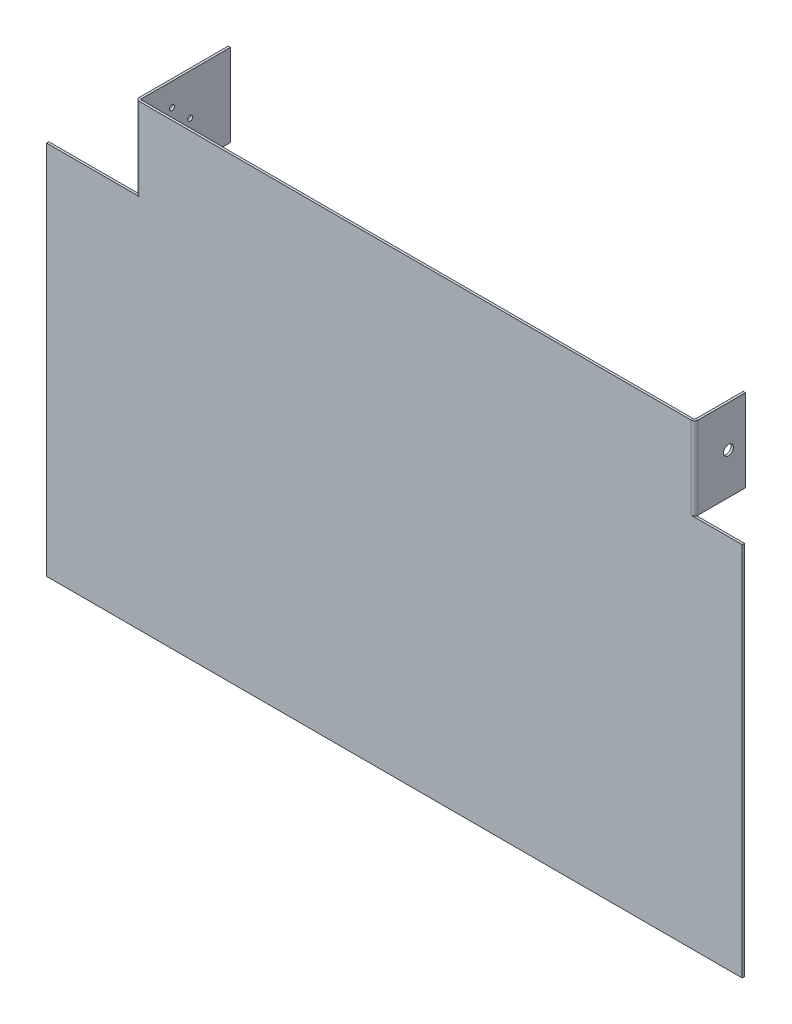
ISO-10303-21;
HEADER;
FILE_DESCRIPTION(('STEP AP214'),'2;1');
FILE_NAME('part.step','',(''),(''),'','','');
FILE_SCHEMA(('AUTOMOTIVE_DESIGN { 1 0 10303 214 1 1 1 1 }'));
ENDSEC;
DATA;
#1=APPLICATION_CONTEXT('core data for automotive mechanical design processes');
#2=APPLICATION_PROTOCOL_DEFINITION('international standard','automotive_design',2000,#1);
#3=PRODUCT_CONTEXT('',#1,'mechanical');
#4=PRODUCT('Part','Part','',(#3));
#5=PRODUCT_RELATED_PRODUCT_CATEGORY('part','',(#4));
#6=PRODUCT_DEFINITION_FORMATION('','',#4);
#7=PRODUCT_DEFINITION_CONTEXT('part definition',#1,'design');
#8=PRODUCT_DEFINITION('design','',#6,#7);
#9=PRODUCT_DEFINITION_SHAPE('','',#8);
#10=(LENGTH_UNIT() NAMED_UNIT(*) SI_UNIT(.MILLI.,.METRE.));
#11=(NAMED_UNIT(*) PLANE_ANGLE_UNIT() SI_UNIT($,.RADIAN.));
#12=(NAMED_UNIT(*) SI_UNIT($,.STERADIAN.) SOLID_ANGLE_UNIT());
#13=UNCERTAINTY_MEASURE_WITH_UNIT(LENGTH_MEASURE(1.E-05),#10,'distance_accuracy_value','');
#14=(GEOMETRIC_REPRESENTATION_CONTEXT(3) GLOBAL_UNCERTAINTY_ASSIGNED_CONTEXT((#13)) GLOBAL_UNIT_ASSIGNED_CONTEXT((#10,
#11,#12)) REPRESENTATION_CONTEXT('',''));
#15=CARTESIAN_POINT('',(0.,0.,0.));
#16=DIRECTION('',(0.,0.,1.));
#17=DIRECTION('',(1.,0.,0.));
#18=AXIS2_PLACEMENT_3D('',#15,#16,#17);
#19=CARTESIAN_POINT('',(0.,0.,-1.));
#20=DIRECTION('',(0.,0.,1.));
#21=DIRECTION('',(1.,0.,0.));
#22=AXIS2_PLACEMENT_3D('',#19,#20,#21);
#23=PLANE('',#22);
#24=DIRECTION('',(0.,-1.,0.));
#25=VECTOR('',#24,1.);
#26=CARTESIAN_POINT('',(-22.3,164.,-0.999999999999994));
#27=LINE('',#26,#25);
#28=CARTESIAN_POINT('',(-22.3,164.,-0.999999999999994));
#29=VERTEX_POINT('',#28);
#30=CARTESIAN_POINT('',(-22.3,200.,-1.));
#31=VERTEX_POINT('',#30);
#32=EDGE_CURVE('E254',#29,#31,#27,.F.);
#33=ORIENTED_EDGE('',*,*,#32,.F.);
#34=DIRECTION('',(-1.,0.,0.));
#35=VECTOR('',#34,1.);
#36=CARTESIAN_POINT('',(-20.8,164.,-1.));
#37=LINE('',#36,#35);
#38=CARTESIAN_POINT('',(-20.8857864376269,164.,-1.));
#39=VERTEX_POINT('',#38);
#40=EDGE_CURVE('E97',#39,#29,#37,.T.);
#41=ORIENTED_EDGE('',*,*,#40,.F.);
#42=CARTESIAN_POINT('',(0.,164.,-1.));
#43=VERTEX_POINT('',#42);
#44=EDGE_CURVE('E265',#43,#39,#37,.T.);
#45=ORIENTED_EDGE('',*,*,#44,.F.);
#46=DIRECTION('',(0.,1.,0.));
#47=VECTOR('',#46,1.);
#48=CARTESIAN_POINT('',(0.,0.,-1.));
#49=LINE('',#48,#47);
#50=CARTESIAN_POINT('',(0.,0.,-1.));
#51=VERTEX_POINT('',#50);
#52=EDGE_CURVE('E361',#51,#43,#49,.T.);
#53=ORIENTED_EDGE('',*,*,#52,.F.);
#54=DIRECTION('',(1.,0.,0.));
#55=VECTOR('',#54,1.);
#56=CARTESIAN_POINT('',(0.,0.,-1.));
#57=LINE('',#56,#55);
#58=CARTESIAN_POINT('',(-304.,0.,-1.));
#59=VERTEX_POINT('',#58);
#60=EDGE_CURVE('E369',#59,#51,#57,.T.);
#61=ORIENTED_EDGE('',*,*,#60,.F.);
#62=DIRECTION('',(0.,-1.,0.));
#63=VECTOR('',#62,1.);
#64=CARTESIAN_POINT('',(-304.,0.,-1.));
#65=LINE('',#64,#63);
#66=CARTESIAN_POINT('',(-304.,164.,-0.999999999999999));
#67=VERTEX_POINT('',#66);
#68=EDGE_CURVE('E367',#67,#59,#65,.T.);
#69=ORIENTED_EDGE('',*,*,#68,.F.);
#70=DIRECTION('',(1.,0.,0.));
#71=VECTOR('',#70,1.);
#72=CARTESIAN_POINT('',(0.,164.,-1.));
#73=LINE('',#72,#71);
#74=CARTESIAN_POINT('',(-264.914213562373,164.,-1.));
#75=VERTEX_POINT('',#74);
#76=EDGE_CURVE('E357',#67,#75,#73,.T.);
#77=ORIENTED_EDGE('',*,*,#76,.T.);
#78=CARTESIAN_POINT('',(-263.5,164.,-1.));
#79=VERTEX_POINT('',#78);
#80=EDGE_CURVE('E356',#75,#79,#73,.T.);
#81=ORIENTED_EDGE('',*,*,#80,.T.);
#82=DIRECTION('',(0.,1.,0.));
#83=VECTOR('',#82,1.);
#84=CARTESIAN_POINT('',(-263.5,200.,-1.));
#85=LINE('',#84,#83);
#86=CARTESIAN_POINT('',(-263.5,200.,-1.));
#87=VERTEX_POINT('',#86);
#88=EDGE_CURVE('E344',#87,#79,#85,.F.);
#89=ORIENTED_EDGE('',*,*,#88,.F.);
#90=DIRECTION('',(-1.,0.,0.));
#91=VECTOR('',#90,1.);
#92=CARTESIAN_POINT('',(0.,200.,-1.));
#93=LINE('',#92,#91);
#94=EDGE_CURVE('E364',#31,#87,#93,.T.);
#95=ORIENTED_EDGE('',*,*,#94,.F.);
#96=EDGE_LOOP('',(#33,#41,#45,#53,#61,#69,#77,#81,#89,#95));
#97=FACE_BOUND('',#96,.T.);
#98=ADVANCED_FACE('F79',(#97),#23,.F.);
#99=CARTESIAN_POINT('',(0.,0.,0.));
#100=DIRECTION('',(0.,0.,1.));
#101=DIRECTION('',(1.,0.,0.));
#102=AXIS2_PLACEMENT_3D('',#99,#100,#101);
#103=PLANE('',#102);
#104=DIRECTION('',(1.,0.,0.));
#105=VECTOR('',#104,1.);
#106=CARTESIAN_POINT('',(-20.8,164.,0.));
#107=LINE('',#106,#105);
#108=CARTESIAN_POINT('',(-22.3,164.,0.));
#109=VERTEX_POINT('',#108);
#110=CARTESIAN_POINT('',(0.,164.,0.));
#111=VERTEX_POINT('',#110);
#112=EDGE_CURVE('E104',#109,#111,#107,.T.);
#113=ORIENTED_EDGE('',*,*,#112,.F.);
#114=DIRECTION('',(0.,-1.,0.));
#115=VECTOR('',#114,1.);
#116=CARTESIAN_POINT('',(-22.3,164.,0.));
#117=LINE('',#116,#115);
#118=CARTESIAN_POINT('',(-22.3,200.,0.));
#119=VERTEX_POINT('',#118);
#120=EDGE_CURVE('E244',#109,#119,#117,.F.);
#121=ORIENTED_EDGE('',*,*,#120,.T.);
#122=DIRECTION('',(-1.,0.,0.));
#123=VECTOR('',#122,1.);
#124=CARTESIAN_POINT('',(0.,200.,0.));
#125=LINE('',#124,#123);
#126=CARTESIAN_POINT('',(-263.5,200.,0.));
#127=VERTEX_POINT('',#126);
#128=EDGE_CURVE('E374',#119,#127,#125,.T.);
#129=ORIENTED_EDGE('',*,*,#128,.T.);
#130=DIRECTION('',(0.,1.,0.));
#131=VECTOR('',#130,1.);
#132=CARTESIAN_POINT('',(-263.5,200.,0.));
#133=LINE('',#132,#131);
#134=CARTESIAN_POINT('',(-263.5,164.,0.));
#135=VERTEX_POINT('',#134);
#136=EDGE_CURVE('E330',#127,#135,#133,.F.);
#137=ORIENTED_EDGE('',*,*,#136,.T.);
#138=DIRECTION('',(1.,0.,0.));
#139=VECTOR('',#138,1.);
#140=CARTESIAN_POINT('',(-265.,164.,0.));
#141=LINE('',#140,#139);
#142=CARTESIAN_POINT('',(-304.,164.,0.));
#143=VERTEX_POINT('',#142);
#144=EDGE_CURVE('E351',#143,#135,#141,.T.);
#145=ORIENTED_EDGE('',*,*,#144,.F.);
#146=DIRECTION('',(0.,-1.,0.));
#147=VECTOR('',#146,1.);
#148=CARTESIAN_POINT('',(-304.,0.,0.));
#149=LINE('',#148,#147);
#150=CARTESIAN_POINT('',(-304.,0.,0.));
#151=VERTEX_POINT('',#150);
#152=EDGE_CURVE('E376',#143,#151,#149,.T.);
#153=ORIENTED_EDGE('',*,*,#152,.T.);
#154=DIRECTION('',(1.,0.,0.));
#155=VECTOR('',#154,1.);
#156=CARTESIAN_POINT('',(0.,0.,0.));
#157=LINE('',#156,#155);
#158=CARTESIAN_POINT('',(0.,0.,0.));
#159=VERTEX_POINT('',#158);
#160=EDGE_CURVE('E365',#151,#159,#157,.T.);
#161=ORIENTED_EDGE('',*,*,#160,.T.);
#162=DIRECTION('',(0.,1.,0.));
#163=VECTOR('',#162,1.);
#164=CARTESIAN_POINT('',(0.,0.,0.));
#165=LINE('',#164,#163);
#166=EDGE_CURVE('E360',#159,#111,#165,.T.);
#167=ORIENTED_EDGE('',*,*,#166,.T.);
#168=EDGE_LOOP('',(#113,#121,#129,#137,#145,#153,#161,#167));
#169=FACE_BOUND('',#168,.T.);
#170=ADVANCED_FACE('F392',(#169),#103,.T.);
#171=CARTESIAN_POINT('',(0.,200.,-1.));
#172=DIRECTION('',(0.,1.,0.));
#173=DIRECTION('',(-1.,0.,0.));
#174=AXIS2_PLACEMENT_3D('',#171,#172,#173);
#175=PLANE('',#174);
#176=DIRECTION('',(0.,0.,1.));
#177=VECTOR('',#176,1.);
#178=CARTESIAN_POINT('',(-22.3,200.,-1.));
#179=LINE('',#178,#177);
#180=EDGE_CURVE('E248',#31,#119,#179,.T.);
#181=ORIENTED_EDGE('',*,*,#180,.F.);
#182=ORIENTED_EDGE('',*,*,#94,.T.);
#183=DIRECTION('',(0.,0.,1.));
#184=VECTOR('',#183,1.);
#185=CARTESIAN_POINT('',(-263.5,200.,-1.));
#186=LINE('',#185,#184);
#187=EDGE_CURVE('E338',#87,#127,#186,.T.);
#188=ORIENTED_EDGE('',*,*,#187,.T.);
#189=ORIENTED_EDGE('',*,*,#128,.F.);
#190=EDGE_LOOP('',(#181,#182,#188,#189));
#191=FACE_BOUND('',#190,.T.);
#192=ADVANCED_FACE('F435',(#191),#175,.T.);
#193=CARTESIAN_POINT('',(0.,0.,-1.));
#194=DIRECTION('',(1.,0.,0.));
#195=DIRECTION('',(0.,0.,-1.));
#196=AXIS2_PLACEMENT_3D('',#193,#194,#195);
#197=PLANE('',#196);
#198=DIRECTION('',(0.,0.,1.));
#199=VECTOR('',#198,1.);
#200=CARTESIAN_POINT('',(0.,164.,-40.43));
#201=LINE('',#200,#199);
#202=EDGE_CURVE('E263',#43,#111,#201,.T.);
#203=ORIENTED_EDGE('',*,*,#202,.T.);
#204=ORIENTED_EDGE('',*,*,#166,.F.);
#205=DIRECTION('',(0.,0.,1.));
#206=VECTOR('',#205,1.);
#207=CARTESIAN_POINT('',(0.,0.,-1.));
#208=LINE('',#207,#206);
#209=EDGE_CURVE('E88',#51,#159,#208,.T.);
#210=ORIENTED_EDGE('',*,*,#209,.F.);
#211=ORIENTED_EDGE('',*,*,#52,.T.);
#212=EDGE_LOOP('',(#203,#204,#210,#211));
#213=FACE_BOUND('',#212,.T.);
#214=ADVANCED_FACE('F81',(#213),#197,.T.);
#215=CARTESIAN_POINT('',(0.,0.,-1.));
#216=DIRECTION('',(0.,-1.,0.));
#217=DIRECTION('',(1.,0.,0.));
#218=AXIS2_PLACEMENT_3D('',#215,#216,#217);
#219=PLANE('',#218);
#220=ORIENTED_EDGE('',*,*,#160,.F.);
#221=DIRECTION('',(0.,0.,1.));
#222=VECTOR('',#221,1.);
#223=CARTESIAN_POINT('',(-304.,0.,-1.));
#224=LINE('',#223,#222);
#225=EDGE_CURVE('E83',#59,#151,#224,.T.);
#226=ORIENTED_EDGE('',*,*,#225,.F.);
#227=ORIENTED_EDGE('',*,*,#60,.T.);
#228=ORIENTED_EDGE('',*,*,#209,.T.);
#229=EDGE_LOOP('',(#220,#226,#227,#228));
#230=FACE_BOUND('',#229,.T.);
#231=ADVANCED_FACE('F390',(#230),#219,.T.);
#232=CARTESIAN_POINT('',(-304.,0.,-1.));
#233=DIRECTION('',(-1.,0.,0.));
#234=DIRECTION('',(0.,0.,1.));
#235=AXIS2_PLACEMENT_3D('',#232,#233,#234);
#236=PLANE('',#235);
#237=DIRECTION('',(0.,0.,1.));
#238=VECTOR('',#237,1.);
#239=CARTESIAN_POINT('',(-304.,164.,-10.));
#240=LINE('',#239,#238);
#241=EDGE_CURVE('E354',#67,#143,#240,.T.);
#242=ORIENTED_EDGE('',*,*,#241,.F.);
#243=ORIENTED_EDGE('',*,*,#68,.T.);
#244=ORIENTED_EDGE('',*,*,#225,.T.);
#245=ORIENTED_EDGE('',*,*,#152,.F.);
#246=EDGE_LOOP('',(#242,#243,#244,#245));
#247=FACE_BOUND('',#246,.T.);
#248=ADVANCED_FACE('F387',(#247),#236,.T.);
#249=CARTESIAN_POINT('',(-265.,164.,-10.));
#250=DIRECTION('',(0.,-1.,0.));
#251=DIRECTION('',(0.,0.,-1.));
#252=AXIS2_PLACEMENT_3D('',#249,#250,#251);
#253=PLANE('',#252);
#254=ORIENTED_EDGE('',*,*,#144,.T.);
#255=CARTESIAN_POINT('',(-263.5,164.,-1.5));
#256=DIRECTION('',(0.,1.,0.));
#257=DIRECTION('',(0.,0.,1.));
#258=AXIS2_PLACEMENT_3D('',#255,#256,#257);
#259=CIRCLE('',#258,1.5);
#260=EDGE_CURVE('E335',#135,#75,#259,.F.);
#261=ORIENTED_EDGE('',*,*,#260,.T.);
#262=ORIENTED_EDGE('',*,*,#76,.F.);
#263=ORIENTED_EDGE('',*,*,#241,.T.);
#264=EDGE_LOOP('',(#254,#261,#262,#263));
#265=FACE_BOUND('',#264,.T.);
#266=ADVANCED_FACE('F396',(#265),#253,.F.);
#267=CARTESIAN_POINT('',(-263.5,164.,-1.5));
#268=DIRECTION('',(0.,-1.,0.));
#269=DIRECTION('',(0.,0.,-1.));
#270=AXIS2_PLACEMENT_3D('',#267,#268,#269);
#271=PLANE('',#270);
#272=ORIENTED_EDGE('',*,*,#80,.F.);
#273=CARTESIAN_POINT('',(-265.,164.,-1.5));
#274=VERTEX_POINT('',#273);
#275=EDGE_CURVE('E333',#75,#274,#259,.F.);
#276=ORIENTED_EDGE('',*,*,#275,.T.);
#277=DIRECTION('',(-1.,0.,0.));
#278=VECTOR('',#277,1.);
#279=CARTESIAN_POINT('',(-265.,164.,-1.5));
#280=LINE('',#279,#278);
#281=CARTESIAN_POINT('',(-264.,164.,-1.5));
#282=VERTEX_POINT('',#281);
#283=EDGE_CURVE('E297',#282,#274,#280,.T.);
#284=ORIENTED_EDGE('',*,*,#283,.F.);
#285=CARTESIAN_POINT('',(-263.5,164.,-1.5));
#286=DIRECTION('',(0.,1.,0.));
#287=DIRECTION('',(0.,0.,1.));
#288=AXIS2_PLACEMENT_3D('',#285,#286,#287);
#289=CIRCLE('',#288,0.5);
#290=EDGE_CURVE('E341',#79,#282,#289,.F.);
#291=ORIENTED_EDGE('',*,*,#290,.F.);
#292=EDGE_LOOP('',(#272,#276,#284,#291));
#293=FACE_BOUND('',#292,.T.);
#294=ADVANCED_FACE('F465',(#293),#271,.T.);
#295=CARTESIAN_POINT('',(-263.5,200.,-1.5));
#296=DIRECTION('',(0.,-1.,0.));
#297=DIRECTION('',(0.,0.,-1.));
#298=AXIS2_PLACEMENT_3D('',#295,#296,#297);
#299=PLANE('',#298);
#300=CARTESIAN_POINT('',(-263.5,200.,-1.5));
#301=DIRECTION('',(0.,1.,0.));
#302=DIRECTION('',(0.,0.,1.));
#303=AXIS2_PLACEMENT_3D('',#300,#301,#302);
#304=CIRCLE('',#303,0.5);
#305=CARTESIAN_POINT('',(-264.,200.,-1.5));
#306=VERTEX_POINT('',#305);
#307=EDGE_CURVE('E300',#306,#87,#304,.T.);
#308=ORIENTED_EDGE('',*,*,#307,.F.);
#309=DIRECTION('',(-1.,0.,0.));
#310=VECTOR('',#309,1.);
#311=CARTESIAN_POINT('',(-264.,200.,-1.5));
#312=LINE('',#311,#310);
#313=CARTESIAN_POINT('',(-265.,200.,-1.5));
#314=VERTEX_POINT('',#313);
#315=EDGE_CURVE('E323',#306,#314,#312,.T.);
#316=ORIENTED_EDGE('',*,*,#315,.T.);
#317=CARTESIAN_POINT('',(-263.5,200.,-1.5));
#318=DIRECTION('',(0.,1.,0.));
#319=DIRECTION('',(0.,0.,1.));
#320=AXIS2_PLACEMENT_3D('',#317,#318,#319);
#321=CIRCLE('',#320,1.5);
#322=EDGE_CURVE('E334',#314,#127,#321,.T.);
#323=ORIENTED_EDGE('',*,*,#322,.T.);
#324=ORIENTED_EDGE('',*,*,#187,.F.);
#325=EDGE_LOOP('',(#308,#316,#323,#324));
#326=FACE_BOUND('',#325,.T.);
#327=ADVANCED_FACE('F443',(#326),#299,.F.);
#328=CARTESIAN_POINT('',(-263.5,200.,-1.5));
#329=DIRECTION('',(0.,1.,0.));
#330=DIRECTION('',(-1.,0.,0.));
#331=AXIS2_PLACEMENT_3D('',#328,#329,#330);
#332=CYLINDRICAL_SURFACE('',#331,1.5);
#333=ORIENTED_EDGE('',*,*,#136,.F.);
#334=ORIENTED_EDGE('',*,*,#322,.F.);
#335=DIRECTION('',(0.,1.,0.));
#336=VECTOR('',#335,1.);
#337=CARTESIAN_POINT('',(-265.,0.,-1.5));
#338=LINE('',#337,#336);
#339=EDGE_CURVE('E320',#274,#314,#338,.T.);
#340=ORIENTED_EDGE('',*,*,#339,.F.);
#341=ORIENTED_EDGE('',*,*,#275,.F.);
#342=ORIENTED_EDGE('',*,*,#260,.F.);
#343=EDGE_LOOP('',(#333,#334,#340,#341,#342));
#344=FACE_BOUND('',#343,.T.);
#345=ADVANCED_FACE('F460',(#344),#332,.T.);
#346=CARTESIAN_POINT('',(-263.5,200.,-1.5));
#347=DIRECTION('',(0.,1.,0.));
#348=DIRECTION('',(-1.,0.,0.));
#349=AXIS2_PLACEMENT_3D('',#346,#347,#348);
#350=CYLINDRICAL_SURFACE('',#349,0.5);
#351=ORIENTED_EDGE('',*,*,#88,.T.);
#352=ORIENTED_EDGE('',*,*,#290,.T.);
#353=DIRECTION('',(0.,-1.,0.));
#354=VECTOR('',#353,1.);
#355=CARTESIAN_POINT('',(-264.,164.,-1.5));
#356=LINE('',#355,#354);
#357=EDGE_CURVE('E326',#282,#306,#356,.F.);
#358=ORIENTED_EDGE('',*,*,#357,.T.);
#359=ORIENTED_EDGE('',*,*,#307,.T.);
#360=EDGE_LOOP('',(#351,#352,#358,#359));
#361=FACE_BOUND('',#360,.T.);
#362=ADVANCED_FACE('F439',(#361),#350,.F.);
#363=CARTESIAN_POINT('',(-265.,200.,-0.999999999999996));
#364=DIRECTION('',(0.,1.,0.));
#365=DIRECTION('',(0.,0.,1.));
#366=AXIS2_PLACEMENT_3D('',#363,#364,#365);
#367=PLANE('',#366);
#368=DIRECTION('',(0.,0.,1.));
#369=VECTOR('',#368,1.);
#370=CARTESIAN_POINT('',(-265.,200.,-0.999999999999996));
#371=LINE('',#370,#369);
#372=CARTESIAN_POINT('',(-265.,200.,-40.429));
#373=VERTEX_POINT('',#372);
#374=EDGE_CURVE('E304',#373,#314,#371,.T.);
#375=ORIENTED_EDGE('',*,*,#374,.T.);
#376=ORIENTED_EDGE('',*,*,#315,.F.);
#377=DIRECTION('',(0.,0.,-1.));
#378=VECTOR('',#377,1.);
#379=CARTESIAN_POINT('',(-264.,200.,7.46174393278213E-13));
#380=LINE('',#379,#378);
#381=CARTESIAN_POINT('',(-264.,200.,-40.429));
#382=VERTEX_POINT('',#381);
#383=EDGE_CURVE('E312',#382,#306,#380,.F.);
#384=ORIENTED_EDGE('',*,*,#383,.F.);
#385=DIRECTION('',(1.,0.,0.));
#386=VECTOR('',#385,1.);
#387=CARTESIAN_POINT('',(-265.,200.,-40.429));
#388=LINE('',#387,#386);
#389=EDGE_CURVE('E298',#373,#382,#388,.T.);
#390=ORIENTED_EDGE('',*,*,#389,.F.);
#391=EDGE_LOOP('',(#375,#376,#384,#390));
#392=FACE_BOUND('',#391,.T.);
#393=ADVANCED_FACE('F451',(#392),#367,.T.);
#394=CARTESIAN_POINT('',(-265.,164.,-40.429));
#395=DIRECTION('',(0.,-1.,0.));
#396=DIRECTION('',(0.,0.,-1.));
#397=AXIS2_PLACEMENT_3D('',#394,#395,#396);
#398=PLANE('',#397);
#399=DIRECTION('',(0.,0.,1.));
#400=VECTOR('',#399,1.);
#401=CARTESIAN_POINT('',(-264.,164.,7.46174393278213E-13));
#402=LINE('',#401,#400);
#403=CARTESIAN_POINT('',(-264.,164.,-40.429));
#404=VERTEX_POINT('',#403);
#405=EDGE_CURVE('E318',#282,#404,#402,.F.);
#406=ORIENTED_EDGE('',*,*,#405,.F.);
#407=ORIENTED_EDGE('',*,*,#283,.T.);
#408=DIRECTION('',(0.,0.,-1.));
#409=VECTOR('',#408,1.);
#410=CARTESIAN_POINT('',(-265.,164.,-40.429));
#411=LINE('',#410,#409);
#412=CARTESIAN_POINT('',(-265.,164.,-40.429));
#413=VERTEX_POINT('',#412);
#414=EDGE_CURVE('E310',#274,#413,#411,.T.);
#415=ORIENTED_EDGE('',*,*,#414,.T.);
#416=DIRECTION('',(1.,0.,0.));
#417=VECTOR('',#416,1.);
#418=CARTESIAN_POINT('',(-265.,164.,-40.429));
#419=LINE('',#418,#417);
#420=EDGE_CURVE('E301',#413,#404,#419,.T.);
#421=ORIENTED_EDGE('',*,*,#420,.T.);
#422=EDGE_LOOP('',(#406,#407,#415,#421));
#423=FACE_BOUND('',#422,.T.);
#424=ADVANCED_FACE('F462',(#423),#398,.T.);
#425=CARTESIAN_POINT('',(-265.,0.,7.49665874617056E-13));
#426=DIRECTION('',(-1.,0.,0.));
#427=DIRECTION('',(0.,0.,1.));
#428=AXIS2_PLACEMENT_3D('',#425,#426,#427);
#429=PLANE('',#428);
#430=CARTESIAN_POINT('',(-265.,182.,-6.8000000000002));
#431=DIRECTION('',(-1.,0.,0.));
#432=DIRECTION('',(0.,0.,1.));
#433=AXIS2_PLACEMENT_3D('',#430,#431,#432);
#434=CIRCLE('',#433,1.10000000000002);
#435=CARTESIAN_POINT('',(-265.,182.,-5.70000000000018));
#436=VERTEX_POINT('',#435);
#437=EDGE_CURVE('E270',#436,#436,#434,.T.);
#438=ORIENTED_EDGE('',*,*,#437,.F.);
#439=EDGE_LOOP('',(#438));
#440=FACE_BOUND('',#439,.T.);
#441=CARTESIAN_POINT('',(-265.,174.,-14.8000000000003));
#442=DIRECTION('',(-1.,0.,0.));
#443=DIRECTION('',(0.,0.,1.));
#444=AXIS2_PLACEMENT_3D('',#441,#442,#443);
#445=CIRCLE('',#444,1.09999999999999);
#446=CARTESIAN_POINT('',(-265.,174.,-13.7000000000003));
#447=VERTEX_POINT('',#446);
#448=EDGE_CURVE('E276',#447,#447,#445,.T.);
#449=ORIENTED_EDGE('',*,*,#448,.F.);
#450=EDGE_LOOP('',(#449));
#451=FACE_BOUND('',#450,.T.);
#452=CARTESIAN_POINT('',(-265.,182.,-22.8000000000002));
#453=DIRECTION('',(-1.,0.,0.));
#454=DIRECTION('',(0.,0.,1.));
#455=AXIS2_PLACEMENT_3D('',#452,#453,#454);
#456=CIRCLE('',#455,1.09999999999999);
#457=CARTESIAN_POINT('',(-265.,182.,-21.7000000000002));
#458=VERTEX_POINT('',#457);
#459=EDGE_CURVE('E282',#458,#458,#456,.T.);
#460=ORIENTED_EDGE('',*,*,#459,.F.);
#461=EDGE_LOOP('',(#460));
#462=FACE_BOUND('',#461,.T.);
#463=CARTESIAN_POINT('',(-265.,190.,-14.8));
#464=DIRECTION('',(-1.,0.,0.));
#465=DIRECTION('',(0.,0.,1.));
#466=AXIS2_PLACEMENT_3D('',#463,#464,#465);
#467=CIRCLE('',#466,1.09999999999999);
#468=CARTESIAN_POINT('',(-265.,190.,-13.7));
#469=VERTEX_POINT('',#468);
#470=EDGE_CURVE('E288',#469,#469,#467,.T.);
#471=ORIENTED_EDGE('',*,*,#470,.F.);
#472=EDGE_LOOP('',(#471));
#473=FACE_BOUND('',#472,.T.);
#474=CARTESIAN_POINT('',(-265.,182.,-14.8000000000002));
#475=DIRECTION('',(-1.,0.,0.));
#476=DIRECTION('',(0.,0.,1.));
#477=AXIS2_PLACEMENT_3D('',#474,#475,#476);
#478=CIRCLE('',#477,3.);
#479=CARTESIAN_POINT('',(-265.,182.,-11.8000000000002));
#480=VERTEX_POINT('',#479);
#481=EDGE_CURVE('E294',#480,#480,#478,.T.);
#482=ORIENTED_EDGE('',*,*,#481,.F.);
#483=EDGE_LOOP('',(#482));
#484=FACE_BOUND('',#483,.T.);
#485=ORIENTED_EDGE('',*,*,#414,.F.);
#486=ORIENTED_EDGE('',*,*,#339,.T.);
#487=ORIENTED_EDGE('',*,*,#374,.F.);
#488=DIRECTION('',(0.,1.,0.));
#489=VECTOR('',#488,1.);
#490=CARTESIAN_POINT('',(-265.,200.,-40.429));
#491=LINE('',#490,#489);
#492=EDGE_CURVE('E307',#413,#373,#491,.T.);
#493=ORIENTED_EDGE('',*,*,#492,.F.);
#494=EDGE_LOOP('',(#485,#486,#487,#493));
#495=FACE_BOUND('',#494,.T.);
#496=ADVANCED_FACE('F456',(#440,#451,#462,#473,#484,#495),#429,.T.);
#497=CARTESIAN_POINT('',(-264.,0.,7.46174393278213E-13));
#498=DIRECTION('',(-1.,0.,0.));
#499=DIRECTION('',(0.,0.,1.));
#500=AXIS2_PLACEMENT_3D('',#497,#498,#499);
#501=PLANE('',#500);
#502=CARTESIAN_POINT('',(-264.,182.,-6.8000000000002));
#503=DIRECTION('',(1.,0.,0.));
#504=DIRECTION('',(0.,0.,-1.));
#505=AXIS2_PLACEMENT_3D('',#502,#503,#504);
#506=CIRCLE('',#505,1.10000000000002);
#507=CARTESIAN_POINT('',(-264.,182.,-7.90000000000022));
#508=VERTEX_POINT('',#507);
#509=EDGE_CURVE('E267',#508,#508,#506,.T.);
#510=ORIENTED_EDGE('',*,*,#509,.F.);
#511=EDGE_LOOP('',(#510));
#512=FACE_BOUND('',#511,.T.);
#513=CARTESIAN_POINT('',(-264.,174.,-14.8000000000003));
#514=DIRECTION('',(1.,0.,0.));
#515=DIRECTION('',(0.,0.,-1.));
#516=AXIS2_PLACEMENT_3D('',#513,#514,#515);
#517=CIRCLE('',#516,1.09999999999999);
#518=CARTESIAN_POINT('',(-264.,174.,-15.9000000000003));
#519=VERTEX_POINT('',#518);
#520=EDGE_CURVE('E273',#519,#519,#517,.T.);
#521=ORIENTED_EDGE('',*,*,#520,.F.);
#522=EDGE_LOOP('',(#521));
#523=FACE_BOUND('',#522,.T.);
#524=CARTESIAN_POINT('',(-264.,182.,-22.8000000000002));
#525=DIRECTION('',(1.,0.,0.));
#526=DIRECTION('',(0.,0.,-1.));
#527=AXIS2_PLACEMENT_3D('',#524,#525,#526);
#528=CIRCLE('',#527,1.09999999999999);
#529=CARTESIAN_POINT('',(-264.,182.,-23.9000000000002));
#530=VERTEX_POINT('',#529);
#531=EDGE_CURVE('E279',#530,#530,#528,.T.);
#532=ORIENTED_EDGE('',*,*,#531,.F.);
#533=EDGE_LOOP('',(#532));
#534=FACE_BOUND('',#533,.T.);
#535=CARTESIAN_POINT('',(-264.,190.,-14.8));
#536=DIRECTION('',(1.,0.,0.));
#537=DIRECTION('',(0.,0.,-1.));
#538=AXIS2_PLACEMENT_3D('',#535,#536,#537);
#539=CIRCLE('',#538,1.09999999999999);
#540=CARTESIAN_POINT('',(-264.,190.,-15.9));
#541=VERTEX_POINT('',#540);
#542=EDGE_CURVE('E285',#541,#541,#539,.T.);
#543=ORIENTED_EDGE('',*,*,#542,.F.);
#544=EDGE_LOOP('',(#543));
#545=FACE_BOUND('',#544,.T.);
#546=CARTESIAN_POINT('',(-264.,182.,-14.8000000000002));
#547=DIRECTION('',(1.,0.,0.));
#548=DIRECTION('',(0.,0.,-1.));
#549=AXIS2_PLACEMENT_3D('',#546,#547,#548);
#550=CIRCLE('',#549,3.);
#551=CARTESIAN_POINT('',(-264.,182.,-17.8000000000002));
#552=VERTEX_POINT('',#551);
#553=EDGE_CURVE('E291',#552,#552,#550,.T.);
#554=ORIENTED_EDGE('',*,*,#553,.F.);
#555=EDGE_LOOP('',(#554));
#556=FACE_BOUND('',#555,.T.);
#557=ORIENTED_EDGE('',*,*,#357,.F.);
#558=ORIENTED_EDGE('',*,*,#405,.T.);
#559=DIRECTION('',(0.,-1.,0.));
#560=VECTOR('',#559,1.);
#561=CARTESIAN_POINT('',(-264.,0.,-40.429));
#562=LINE('',#561,#560);
#563=EDGE_CURVE('E315',#404,#382,#562,.F.);
#564=ORIENTED_EDGE('',*,*,#563,.T.);
#565=ORIENTED_EDGE('',*,*,#383,.T.);
#566=EDGE_LOOP('',(#557,#558,#564,#565));
#567=FACE_BOUND('',#566,.T.);
#568=ADVANCED_FACE('F447',(#512,#523,#534,#545,#556,#567),#501,.F.);
#569=CARTESIAN_POINT('',(-265.,200.,-40.429));
#570=DIRECTION('',(0.,0.,-1.));
#571=DIRECTION('',(-1.,0.,0.));
#572=AXIS2_PLACEMENT_3D('',#569,#570,#571);
#573=PLANE('',#572);
#574=ORIENTED_EDGE('',*,*,#563,.F.);
#575=ORIENTED_EDGE('',*,*,#420,.F.);
#576=ORIENTED_EDGE('',*,*,#492,.T.);
#577=ORIENTED_EDGE('',*,*,#389,.T.);
#578=EDGE_LOOP('',(#574,#575,#576,#577));
#579=FACE_BOUND('',#578,.T.);
#580=ADVANCED_FACE('F560',(#579),#573,.T.);
#581=CARTESIAN_POINT('',(-274.,182.,-14.8000000000002));
#582=DIRECTION('',(1.,0.,0.));
#583=DIRECTION('',(0.,0.,-1.));
#584=AXIS2_PLACEMENT_3D('',#581,#582,#583);
#585=CYLINDRICAL_SURFACE('',#584,3.);
#586=ORIENTED_EDGE('',*,*,#481,.T.);
#587=EDGE_LOOP('',(#586));
#588=FACE_BOUND('',#587,.T.);
#589=ORIENTED_EDGE('',*,*,#553,.T.);
#590=EDGE_LOOP('',(#589));
#591=FACE_BOUND('',#590,.T.);
#592=ADVANCED_FACE('F565',(#588,#591),#585,.F.);
#593=CARTESIAN_POINT('',(-274.,190.,-14.8));
#594=DIRECTION('',(1.,0.,0.));
#595=DIRECTION('',(0.,0.,-1.));
#596=AXIS2_PLACEMENT_3D('',#593,#594,#595);
#597=CYLINDRICAL_SURFACE('',#596,1.09999999999999);
#598=ORIENTED_EDGE('',*,*,#470,.T.);
#599=EDGE_LOOP('',(#598));
#600=FACE_BOUND('',#599,.T.);
#601=ORIENTED_EDGE('',*,*,#542,.T.);
#602=EDGE_LOOP('',(#601));
#603=FACE_BOUND('',#602,.T.);
#604=ADVANCED_FACE('F594',(#600,#603),#597,.F.);
#605=CARTESIAN_POINT('',(-274.,182.,-22.8000000000002));
#606=DIRECTION('',(1.,0.,0.));
#607=DIRECTION('',(0.,0.,-1.));
#608=AXIS2_PLACEMENT_3D('',#605,#606,#607);
#609=CYLINDRICAL_SURFACE('',#608,1.09999999999999);
#610=ORIENTED_EDGE('',*,*,#459,.T.);
#611=EDGE_LOOP('',(#610));
#612=FACE_BOUND('',#611,.T.);
#613=ORIENTED_EDGE('',*,*,#531,.T.);
#614=EDGE_LOOP('',(#613));
#615=FACE_BOUND('',#614,.T.);
#616=ADVANCED_FACE('F604',(#612,#615),#609,.F.);
#617=CARTESIAN_POINT('',(-274.,174.,-14.8000000000003));
#618=DIRECTION('',(1.,0.,0.));
#619=DIRECTION('',(0.,0.,-1.));
#620=AXIS2_PLACEMENT_3D('',#617,#618,#619);
#621=CYLINDRICAL_SURFACE('',#620,1.09999999999999);
#622=ORIENTED_EDGE('',*,*,#448,.T.);
#623=EDGE_LOOP('',(#622));
#624=FACE_BOUND('',#623,.T.);
#625=ORIENTED_EDGE('',*,*,#520,.T.);
#626=EDGE_LOOP('',(#625));
#627=FACE_BOUND('',#626,.T.);
#628=ADVANCED_FACE('F614',(#624,#627),#621,.F.);
#629=CARTESIAN_POINT('',(-274.,182.,-6.80000000000017));
#630=DIRECTION('',(1.,0.,0.));
#631=DIRECTION('',(0.,0.,-1.));
#632=AXIS2_PLACEMENT_3D('',#629,#630,#631);
#633=CYLINDRICAL_SURFACE('',#632,1.10000000000002);
#634=ORIENTED_EDGE('',*,*,#437,.T.);
#635=EDGE_LOOP('',(#634));
#636=FACE_BOUND('',#635,.T.);
#637=ORIENTED_EDGE('',*,*,#509,.T.);
#638=EDGE_LOOP('',(#637));
#639=FACE_BOUND('',#638,.T.);
#640=ADVANCED_FACE('F623',(#636,#639),#633,.F.);
#641=CARTESIAN_POINT('',(-20.8,164.,-40.43));
#642=DIRECTION('',(0.,-1.,0.));
#643=DIRECTION('',(0.,0.,-1.));
#644=AXIS2_PLACEMENT_3D('',#641,#642,#643);
#645=PLANE('',#644);
#646=ORIENTED_EDGE('',*,*,#44,.T.);
#647=CARTESIAN_POINT('',(-22.3,164.,-1.49999999999999));
#648=DIRECTION('',(0.,-1.,0.));
#649=DIRECTION('',(0.,0.,-1.));
#650=AXIS2_PLACEMENT_3D('',#647,#648,#649);
#651=CIRCLE('',#650,1.5);
#652=EDGE_CURVE('E13',#39,#109,#651,.T.);
#653=ORIENTED_EDGE('',*,*,#652,.T.);
#654=ORIENTED_EDGE('',*,*,#112,.T.);
#655=ORIENTED_EDGE('',*,*,#202,.F.);
#656=EDGE_LOOP('',(#646,#653,#654,#655));
#657=FACE_BOUND('',#656,.T.);
#658=ADVANCED_FACE('F400',(#657),#645,.F.);
#659=CARTESIAN_POINT('',(-22.3,200.,-1.5));
#660=DIRECTION('',(0.,1.,0.));
#661=DIRECTION('',(0.,0.,1.));
#662=AXIS2_PLACEMENT_3D('',#659,#660,#661);
#663=PLANE('',#662);
#664=DIRECTION('',(-1.,0.,0.));
#665=VECTOR('',#664,1.);
#666=CARTESIAN_POINT('',(-20.8,200.,-1.49999999999999));
#667=LINE('',#666,#665);
#668=CARTESIAN_POINT('',(-21.8,200.,-1.5));
#669=VERTEX_POINT('',#668);
#670=CARTESIAN_POINT('',(-20.8,200.,-1.5));
#671=VERTEX_POINT('',#670);
#672=EDGE_CURVE('E225',#669,#671,#667,.F.);
#673=ORIENTED_EDGE('',*,*,#672,.F.);
#674=CARTESIAN_POINT('',(-22.3,200.,-1.5));
#675=DIRECTION('',(0.,-1.,0.));
#676=DIRECTION('',(0.,0.,-1.));
#677=AXIS2_PLACEMENT_3D('',#674,#675,#676);
#678=CIRCLE('',#677,0.5);
#679=EDGE_CURVE('E251',#31,#669,#678,.F.);
#680=ORIENTED_EDGE('',*,*,#679,.F.);
#681=ORIENTED_EDGE('',*,*,#180,.T.);
#682=CARTESIAN_POINT('',(-22.3,200.,-1.5));
#683=DIRECTION('',(0.,-1.,0.));
#684=DIRECTION('',(0.,0.,-1.));
#685=AXIS2_PLACEMENT_3D('',#682,#683,#684);
#686=CIRCLE('',#685,1.5);
#687=EDGE_CURVE('E246',#119,#671,#686,.F.);
#688=ORIENTED_EDGE('',*,*,#687,.T.);
#689=EDGE_LOOP('',(#673,#680,#681,#688));
#690=FACE_BOUND('',#689,.T.);
#691=ADVANCED_FACE('F431',(#690),#663,.T.);
#692=CARTESIAN_POINT('',(-22.3,164.,-1.49999999999999));
#693=DIRECTION('',(0.,1.,0.));
#694=DIRECTION('',(0.,0.,1.));
#695=AXIS2_PLACEMENT_3D('',#692,#693,#694);
#696=PLANE('',#695);
#697=CARTESIAN_POINT('',(-20.8,164.,-1.49999999999999));
#698=VERTEX_POINT('',#697);
#699=EDGE_CURVE('E90',#698,#39,#651,.T.);
#700=ORIENTED_EDGE('',*,*,#699,.T.);
#701=ORIENTED_EDGE('',*,*,#40,.T.);
#702=CARTESIAN_POINT('',(-22.3,164.,-1.49999999999999));
#703=DIRECTION('',(0.,-1.,0.));
#704=DIRECTION('',(0.,0.,-1.));
#705=AXIS2_PLACEMENT_3D('',#702,#703,#704);
#706=CIRCLE('',#705,0.5);
#707=CARTESIAN_POINT('',(-21.8,164.,-1.49999999999999));
#708=VERTEX_POINT('',#707);
#709=EDGE_CURVE('E257',#708,#29,#706,.T.);
#710=ORIENTED_EDGE('',*,*,#709,.F.);
#711=DIRECTION('',(-1.,0.,0.));
#712=VECTOR('',#711,1.);
#713=CARTESIAN_POINT('',(-21.8,164.,-1.49999999999999));
#714=LINE('',#713,#712);
#715=EDGE_CURVE('E237',#708,#698,#714,.F.);
#716=ORIENTED_EDGE('',*,*,#715,.T.);
#717=EDGE_LOOP('',(#700,#701,#710,#716));
#718=FACE_BOUND('',#717,.T.);
#719=ADVANCED_FACE('F407',(#718),#696,.F.);
#720=CARTESIAN_POINT('',(-22.3,164.,-1.49999999999999));
#721=DIRECTION('',(0.,-1.,0.));
#722=DIRECTION('',(1.,0.,0.));
#723=AXIS2_PLACEMENT_3D('',#720,#721,#722);
#724=CYLINDRICAL_SURFACE('',#723,1.5);
#725=ORIENTED_EDGE('',*,*,#120,.F.);
#726=ORIENTED_EDGE('',*,*,#652,.F.);
#727=ORIENTED_EDGE('',*,*,#699,.F.);
#728=DIRECTION('',(0.,-1.,0.));
#729=VECTOR('',#728,1.);
#730=CARTESIAN_POINT('',(-20.8,200.,-1.49999999999999));
#731=LINE('',#730,#729);
#732=EDGE_CURVE('E235',#698,#671,#731,.F.);
#733=ORIENTED_EDGE('',*,*,#732,.T.);
#734=ORIENTED_EDGE('',*,*,#687,.F.);
#735=EDGE_LOOP('',(#725,#726,#727,#733,#734));
#736=FACE_BOUND('',#735,.T.);
#737=ADVANCED_FACE('F404',(#736),#724,.T.);
#738=CARTESIAN_POINT('',(-22.3,164.,-1.49999999999999));
#739=DIRECTION('',(0.,-1.,0.));
#740=DIRECTION('',(1.,0.,0.));
#741=AXIS2_PLACEMENT_3D('',#738,#739,#740);
#742=CYLINDRICAL_SURFACE('',#741,0.5);
#743=ORIENTED_EDGE('',*,*,#32,.T.);
#744=ORIENTED_EDGE('',*,*,#679,.T.);
#745=DIRECTION('',(0.,-1.,0.));
#746=VECTOR('',#745,1.);
#747=CARTESIAN_POINT('',(-21.8,200.,-1.5));
#748=LINE('',#747,#746);
#749=EDGE_CURVE('E240',#669,#708,#748,.T.);
#750=ORIENTED_EDGE('',*,*,#749,.T.);
#751=ORIENTED_EDGE('',*,*,#709,.T.);
#752=EDGE_LOOP('',(#743,#744,#750,#751));
#753=FACE_BOUND('',#752,.T.);
#754=ADVANCED_FACE('F428',(#753),#742,.F.);
#755=CARTESIAN_POINT('',(-20.7999999999999,164.,-22.2292));
#756=DIRECTION('',(0.,1.,0.));
#757=DIRECTION('',(-1.,0.,0.));
#758=AXIS2_PLACEMENT_3D('',#755,#756,#757);
#759=PLANE('',#758);
#760=ORIENTED_EDGE('',*,*,#715,.F.);
#761=DIRECTION('',(0.,0.,1.));
#762=VECTOR('',#761,1.);
#763=CARTESIAN_POINT('',(-21.7999999999999,164.,-22.2292));
#764=LINE('',#763,#762);
#765=CARTESIAN_POINT('',(-21.7999999999999,164.,-22.2292));
#766=VERTEX_POINT('',#765);
#767=EDGE_CURVE('E233',#708,#766,#764,.F.);
#768=ORIENTED_EDGE('',*,*,#767,.T.);
#769=DIRECTION('',(-1.,0.,0.));
#770=VECTOR('',#769,1.);
#771=CARTESIAN_POINT('',(-20.7999999999999,164.,-22.2292));
#772=LINE('',#771,#770);
#773=CARTESIAN_POINT('',(-20.7999999999999,164.,-22.2292));
#774=VERTEX_POINT('',#773);
#775=EDGE_CURVE('E221',#774,#766,#772,.T.);
#776=ORIENTED_EDGE('',*,*,#775,.F.);
#777=DIRECTION('',(0.,0.,-1.));
#778=VECTOR('',#777,1.);
#779=CARTESIAN_POINT('',(-20.8,164.,0.));
#780=LINE('',#779,#778);
#781=EDGE_CURVE('E208',#698,#774,#780,.T.);
#782=ORIENTED_EDGE('',*,*,#781,.F.);
#783=EDGE_LOOP('',(#760,#768,#776,#782));
#784=FACE_BOUND('',#783,.T.);
#785=ADVANCED_FACE('F412',(#784),#759,.F.);
#786=CARTESIAN_POINT('',(-20.8,200.,-0.999999999999997));
#787=DIRECTION('',(0.,-1.,0.));
#788=DIRECTION('',(1.,0.,0.));
#789=AXIS2_PLACEMENT_3D('',#786,#787,#788);
#790=PLANE('',#789);
#791=ORIENTED_EDGE('',*,*,#672,.T.);
#792=DIRECTION('',(0.,0.,1.));
#793=VECTOR('',#792,1.);
#794=CARTESIAN_POINT('',(-20.8,200.,0.));
#795=LINE('',#794,#793);
#796=CARTESIAN_POINT('',(-20.7999999999999,200.,-22.2292));
#797=VERTEX_POINT('',#796);
#798=EDGE_CURVE('E206',#797,#671,#795,.T.);
#799=ORIENTED_EDGE('',*,*,#798,.F.);
#800=DIRECTION('',(-1.,0.,0.));
#801=VECTOR('',#800,1.);
#802=CARTESIAN_POINT('',(-20.7999999999999,200.,-22.2292));
#803=LINE('',#802,#801);
#804=CARTESIAN_POINT('',(-21.7999999999999,200.,-22.2292));
#805=VERTEX_POINT('',#804);
#806=EDGE_CURVE('E214',#797,#805,#803,.T.);
#807=ORIENTED_EDGE('',*,*,#806,.T.);
#808=DIRECTION('',(0.,0.,-1.));
#809=VECTOR('',#808,1.);
#810=CARTESIAN_POINT('',(-21.8,200.,-1.));
#811=LINE('',#810,#809);
#812=EDGE_CURVE('E230',#805,#669,#811,.F.);
#813=ORIENTED_EDGE('',*,*,#812,.T.);
#814=EDGE_LOOP('',(#791,#799,#807,#813));
#815=FACE_BOUND('',#814,.T.);
#816=ADVANCED_FACE('F224',(#815),#790,.F.);
#817=CARTESIAN_POINT('',(-20.8,0.,0.));
#818=DIRECTION('',(-1.,0.,0.));
#819=DIRECTION('',(0.,0.,1.));
#820=AXIS2_PLACEMENT_3D('',#817,#818,#819);
#821=PLANE('',#820);
#822=CARTESIAN_POINT('',(-20.8,182.,-14.8));
#823=DIRECTION('',(-1.,0.,0.));
#824=DIRECTION('',(0.,0.,1.));
#825=AXIS2_PLACEMENT_3D('',#822,#823,#824);
#826=CIRCLE('',#825,2.15);
#827=CARTESIAN_POINT('',(-20.8,182.,-12.65));
#828=VERTEX_POINT('',#827);
#829=EDGE_CURVE('E243',#828,#828,#826,.T.);
#830=ORIENTED_EDGE('',*,*,#829,.T.);
#831=EDGE_LOOP('',(#830));
#832=FACE_BOUND('',#831,.T.);
#833=ORIENTED_EDGE('',*,*,#732,.F.);
#834=ORIENTED_EDGE('',*,*,#781,.T.);
#835=DIRECTION('',(0.,1.,0.));
#836=VECTOR('',#835,1.);
#837=CARTESIAN_POINT('',(-20.7999999999999,0.,-22.2292));
#838=LINE('',#837,#836);
#839=EDGE_CURVE('E201',#774,#797,#838,.T.);
#840=ORIENTED_EDGE('',*,*,#839,.T.);
#841=ORIENTED_EDGE('',*,*,#798,.T.);
#842=EDGE_LOOP('',(#833,#834,#840,#841));
#843=FACE_BOUND('',#842,.T.);
#844=ADVANCED_FACE('F204',(#832,#843),#821,.F.);
#845=CARTESIAN_POINT('',(-21.8,0.,0.));
#846=DIRECTION('',(-1.,0.,0.));
#847=DIRECTION('',(0.,0.,1.));
#848=AXIS2_PLACEMENT_3D('',#845,#846,#847);
#849=PLANE('',#848);
#850=CARTESIAN_POINT('',(-21.8,182.,-14.8));
#851=DIRECTION('',(-1.,0.,0.));
#852=DIRECTION('',(0.,0.,1.));
#853=AXIS2_PLACEMENT_3D('',#850,#851,#852);
#854=CIRCLE('',#853,2.14999999999999);
#855=CARTESIAN_POINT('',(-21.8,182.,-12.65));
#856=VERTEX_POINT('',#855);
#857=EDGE_CURVE('E416',#856,#856,#854,.T.);
#858=ORIENTED_EDGE('',*,*,#857,.F.);
#859=EDGE_LOOP('',(#858));
#860=FACE_BOUND('',#859,.T.);
#861=ORIENTED_EDGE('',*,*,#767,.F.);
#862=ORIENTED_EDGE('',*,*,#749,.F.);
#863=ORIENTED_EDGE('',*,*,#812,.F.);
#864=DIRECTION('',(0.,-1.,0.));
#865=VECTOR('',#864,1.);
#866=CARTESIAN_POINT('',(-21.7999999999999,200.,-22.2292));
#867=LINE('',#866,#865);
#868=EDGE_CURVE('E217',#766,#805,#867,.F.);
#869=ORIENTED_EDGE('',*,*,#868,.F.);
#870=EDGE_LOOP('',(#861,#862,#863,#869));
#871=FACE_BOUND('',#870,.T.);
#872=ADVANCED_FACE('F422',(#860,#871),#849,.T.);
#873=CARTESIAN_POINT('',(-20.7999999999999,200.,-22.2292));
#874=DIRECTION('',(0.,0.,1.));
#875=DIRECTION('',(1.,0.,0.));
#876=AXIS2_PLACEMENT_3D('',#873,#874,#875);
#877=PLANE('',#876);
#878=ORIENTED_EDGE('',*,*,#868,.T.);
#879=ORIENTED_EDGE('',*,*,#806,.F.);
#880=ORIENTED_EDGE('',*,*,#839,.F.);
#881=ORIENTED_EDGE('',*,*,#775,.T.);
#882=EDGE_LOOP('',(#878,#879,#880,#881));
#883=FACE_BOUND('',#882,.T.);
#884=ADVANCED_FACE('F215',(#883),#877,.F.);
#885=CARTESIAN_POINT('',(-21.8,182.,-14.8));
#886=DIRECTION('',(-1.,0.,0.));
#887=DIRECTION('',(0.,0.,1.));
#888=AXIS2_PLACEMENT_3D('',#885,#886,#887);
#889=CYLINDRICAL_SURFACE('',#888,2.15);
#890=ORIENTED_EDGE('',*,*,#829,.F.);
#891=EDGE_LOOP('',(#890));
#892=FACE_BOUND('',#891,.T.);
#893=ORIENTED_EDGE('',*,*,#857,.T.);
#894=EDGE_LOOP('',(#893));
#895=FACE_BOUND('',#894,.T.);
#896=ADVANCED_FACE('F420',(#892,#895),#889,.F.);
#897=CLOSED_SHELL('',(#98,#170,#192,#214,#231,#248,#266,#294,#327,#345,#362,#393,#424,#496,#568,
#580,#592,#604,#616,#628,#640,#658,#691,#719,#737,#754,#785,#816,#844,#872,#884,#896));
#898=MANIFOLD_SOLID_BREP('B2',#897);
#899=ADVANCED_BREP_SHAPE_REPRESENTATION('',(#18,#898),#14);
#900=SHAPE_DEFINITION_REPRESENTATION(#9,#899);
ENDSEC;
END-ISO-10303-21;
